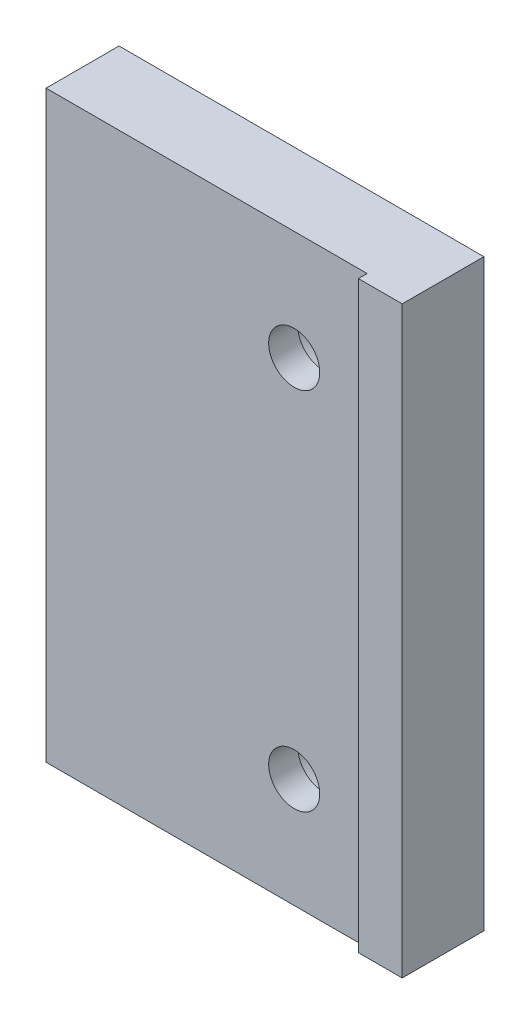
ISO-10303-21;
HEADER;
FILE_DESCRIPTION(('STEP AP214'),'2;1');
FILE_NAME('part.step','',(''),(''),'','','');
FILE_SCHEMA(('AUTOMOTIVE_DESIGN { 1 0 10303 214 1 1 1 1 }'));
ENDSEC;
DATA;
#1=APPLICATION_CONTEXT('core data for automotive mechanical design processes');
#2=APPLICATION_PROTOCOL_DEFINITION('international standard','automotive_design',2000,#1);
#3=PRODUCT_CONTEXT('',#1,'mechanical');
#4=PRODUCT('Part','Part','',(#3));
#5=PRODUCT_RELATED_PRODUCT_CATEGORY('part','',(#4));
#6=PRODUCT_DEFINITION_FORMATION('','',#4);
#7=PRODUCT_DEFINITION_CONTEXT('part definition',#1,'design');
#8=PRODUCT_DEFINITION('design','',#6,#7);
#9=PRODUCT_DEFINITION_SHAPE('','',#8);
#10=(LENGTH_UNIT() NAMED_UNIT(*) SI_UNIT(.MILLI.,.METRE.));
#11=(NAMED_UNIT(*) PLANE_ANGLE_UNIT() SI_UNIT($,.RADIAN.));
#12=(NAMED_UNIT(*) SI_UNIT($,.STERADIAN.) SOLID_ANGLE_UNIT());
#13=UNCERTAINTY_MEASURE_WITH_UNIT(LENGTH_MEASURE(1.E-05),#10,'distance_accuracy_value','');
#14=(GEOMETRIC_REPRESENTATION_CONTEXT(3) GLOBAL_UNCERTAINTY_ASSIGNED_CONTEXT((#13)) GLOBAL_UNIT_ASSIGNED_CONTEXT((#10,
#11,#12)) REPRESENTATION_CONTEXT('',''));
#15=CARTESIAN_POINT('',(0.,0.,0.));
#16=DIRECTION('',(0.,0.,1.));
#17=DIRECTION('',(1.,0.,0.));
#18=AXIS2_PLACEMENT_3D('',#15,#16,#17);
#19=CARTESIAN_POINT('',(17.,32.5,5.));
#20=DIRECTION('',(0.,0.,-1.));
#21=DIRECTION('',(-1.,0.,0.));
#22=AXIS2_PLACEMENT_3D('',#19,#20,#21);
#23=CYLINDRICAL_SURFACE('',#22,1.75);
#24=CARTESIAN_POINT('',(17.,32.5,5.));
#25=DIRECTION('',(0.,0.,1.));
#26=DIRECTION('',(1.,0.,0.));
#27=AXIS2_PLACEMENT_3D('',#24,#25,#26);
#28=CIRCLE('',#27,1.75);
#29=CARTESIAN_POINT('',(18.75,32.5,5.));
#30=VERTEX_POINT('',#29);
#31=EDGE_CURVE('E98',#30,#30,#28,.T.);
#32=ORIENTED_EDGE('',*,*,#31,.T.);
#33=EDGE_LOOP('',(#32));
#34=FACE_BOUND('',#33,.T.);
#35=CARTESIAN_POINT('',(17.,32.5,3.));
#36=DIRECTION('',(0.,0.,-1.));
#37=DIRECTION('',(-1.,0.,0.));
#38=AXIS2_PLACEMENT_3D('',#35,#36,#37);
#39=CIRCLE('',#38,1.75);
#40=CARTESIAN_POINT('',(15.25,32.5,3.));
#41=VERTEX_POINT('',#40);
#42=EDGE_CURVE('E39',#41,#41,#39,.T.);
#43=ORIENTED_EDGE('',*,*,#42,.T.);
#44=EDGE_LOOP('',(#43));
#45=FACE_BOUND('',#44,.T.);
#46=ADVANCED_FACE('F35',(#34,#45),#23,.F.);
#47=CARTESIAN_POINT('',(17.,7.5,5.));
#48=DIRECTION('',(0.,0.,-1.));
#49=DIRECTION('',(-1.,0.,0.));
#50=AXIS2_PLACEMENT_3D('',#47,#48,#49);
#51=CYLINDRICAL_SURFACE('',#50,1.75);
#52=CARTESIAN_POINT('',(17.,7.5,5.));
#53=DIRECTION('',(0.,0.,1.));
#54=DIRECTION('',(1.,0.,0.));
#55=AXIS2_PLACEMENT_3D('',#52,#53,#54);
#56=CIRCLE('',#55,1.75);
#57=CARTESIAN_POINT('',(18.75,7.5,5.));
#58=VERTEX_POINT('',#57);
#59=EDGE_CURVE('E102',#58,#58,#56,.T.);
#60=ORIENTED_EDGE('',*,*,#59,.T.);
#61=EDGE_LOOP('',(#60));
#62=FACE_BOUND('',#61,.T.);
#63=CARTESIAN_POINT('',(17.,7.5,3.));
#64=DIRECTION('',(0.,0.,-1.));
#65=DIRECTION('',(-1.,0.,0.));
#66=AXIS2_PLACEMENT_3D('',#63,#64,#65);
#67=CIRCLE('',#66,1.75);
#68=CARTESIAN_POINT('',(15.25,7.5,3.));
#69=VERTEX_POINT('',#68);
#70=EDGE_CURVE('E110',#69,#69,#67,.T.);
#71=ORIENTED_EDGE('',*,*,#70,.T.);
#72=EDGE_LOOP('',(#71));
#73=FACE_BOUND('',#72,.T.);
#74=ADVANCED_FACE('F183',(#62,#73),#51,.F.);
#75=CARTESIAN_POINT('',(0.,0.,5.));
#76=DIRECTION('',(0.,0.,-1.));
#77=DIRECTION('',(-1.,0.,0.));
#78=AXIS2_PLACEMENT_3D('',#75,#76,#77);
#79=PLANE('',#78);
#80=ORIENTED_EDGE('',*,*,#59,.F.);
#81=EDGE_LOOP('',(#80));
#82=FACE_BOUND('',#81,.T.);
#83=ORIENTED_EDGE('',*,*,#31,.F.);
#84=EDGE_LOOP('',(#83));
#85=FACE_BOUND('',#84,.T.);
#86=DIRECTION('',(0.,-1.,0.));
#87=VECTOR('',#86,1.);
#88=CARTESIAN_POINT('',(22.,40.,5.));
#89=LINE('',#88,#87);
#90=CARTESIAN_POINT('',(22.,40.,5.));
#91=VERTEX_POINT('',#90);
#92=CARTESIAN_POINT('',(22.,0.,5.));
#93=VERTEX_POINT('',#92);
#94=EDGE_CURVE('E52',#91,#93,#89,.T.);
#95=ORIENTED_EDGE('',*,*,#94,.F.);
#96=DIRECTION('',(-1.,0.,0.));
#97=VECTOR('',#96,1.);
#98=CARTESIAN_POINT('',(0.,40.,5.));
#99=LINE('',#98,#97);
#100=CARTESIAN_POINT('',(0.,40.,5.));
#101=VERTEX_POINT('',#100);
#102=EDGE_CURVE('E57',#91,#101,#99,.T.);
#103=ORIENTED_EDGE('',*,*,#102,.T.);
#104=DIRECTION('',(0.,-1.,0.));
#105=VECTOR('',#104,1.);
#106=CARTESIAN_POINT('',(0.,0.,5.));
#107=LINE('',#106,#105);
#108=CARTESIAN_POINT('',(0.,0.,5.));
#109=VERTEX_POINT('',#108);
#110=EDGE_CURVE('E88',#101,#109,#107,.T.);
#111=ORIENTED_EDGE('',*,*,#110,.T.);
#112=DIRECTION('',(1.,0.,0.));
#113=VECTOR('',#112,1.);
#114=CARTESIAN_POINT('',(0.,0.,5.));
#115=LINE('',#114,#113);
#116=EDGE_CURVE('E151',#109,#93,#115,.T.);
#117=ORIENTED_EDGE('',*,*,#116,.T.);
#118=EDGE_LOOP('',(#95,#103,#111,#117));
#119=FACE_BOUND('',#118,.T.);
#120=ADVANCED_FACE('F153',(#82,#85,#119),#79,.F.);
#121=CARTESIAN_POINT('',(0.,0.,0.));
#122=DIRECTION('',(0.,0.,-1.));
#123=DIRECTION('',(-1.,0.,0.));
#124=AXIS2_PLACEMENT_3D('',#121,#122,#123);
#125=PLANE('',#124);
#126=CARTESIAN_POINT('',(17.,7.5,0.));
#127=DIRECTION('',(0.,0.,-1.));
#128=DIRECTION('',(-1.,0.,0.));
#129=AXIS2_PLACEMENT_3D('',#126,#127,#128);
#130=CIRCLE('',#129,3.);
#131=CARTESIAN_POINT('',(14.,7.5,0.));
#132=VERTEX_POINT('',#131);
#133=EDGE_CURVE('E117',#132,#132,#130,.T.);
#134=ORIENTED_EDGE('',*,*,#133,.F.);
#135=EDGE_LOOP('',(#134));
#136=FACE_BOUND('',#135,.T.);
#137=CARTESIAN_POINT('',(17.,32.5,0.));
#138=DIRECTION('',(0.,0.,-1.));
#139=DIRECTION('',(-1.,0.,0.));
#140=AXIS2_PLACEMENT_3D('',#137,#138,#139);
#141=CIRCLE('',#140,3.);
#142=CARTESIAN_POINT('',(14.,32.5,0.));
#143=VERTEX_POINT('',#142);
#144=EDGE_CURVE('E127',#143,#143,#141,.T.);
#145=ORIENTED_EDGE('',*,*,#144,.F.);
#146=EDGE_LOOP('',(#145));
#147=FACE_BOUND('',#146,.T.);
#148=DIRECTION('',(0.,-1.,0.));
#149=VECTOR('',#148,1.);
#150=CARTESIAN_POINT('',(0.,0.,0.));
#151=LINE('',#150,#149);
#152=CARTESIAN_POINT('',(0.,40.,0.));
#153=VERTEX_POINT('',#152);
#154=CARTESIAN_POINT('',(0.,0.,0.));
#155=VERTEX_POINT('',#154);
#156=EDGE_CURVE('E94',#153,#155,#151,.T.);
#157=ORIENTED_EDGE('',*,*,#156,.F.);
#158=DIRECTION('',(-1.,0.,0.));
#159=VECTOR('',#158,1.);
#160=CARTESIAN_POINT('',(0.,40.,0.));
#161=LINE('',#160,#159);
#162=CARTESIAN_POINT('',(25.,40.,0.));
#163=VERTEX_POINT('',#162);
#164=EDGE_CURVE('E77',#163,#153,#161,.T.);
#165=ORIENTED_EDGE('',*,*,#164,.F.);
#166=DIRECTION('',(0.,1.,0.));
#167=VECTOR('',#166,1.);
#168=CARTESIAN_POINT('',(25.,0.,0.));
#169=LINE('',#168,#167);
#170=CARTESIAN_POINT('',(25.,0.,0.));
#171=VERTEX_POINT('',#170);
#172=EDGE_CURVE('E89',#171,#163,#169,.T.);
#173=ORIENTED_EDGE('',*,*,#172,.F.);
#174=DIRECTION('',(1.,0.,0.));
#175=VECTOR('',#174,1.);
#176=CARTESIAN_POINT('',(0.,0.,0.));
#177=LINE('',#176,#175);
#178=EDGE_CURVE('E97',#155,#171,#177,.T.);
#179=ORIENTED_EDGE('',*,*,#178,.F.);
#180=EDGE_LOOP('',(#157,#165,#173,#179));
#181=FACE_BOUND('',#180,.T.);
#182=ADVANCED_FACE('F96',(#136,#147,#181),#125,.T.);
#183=CARTESIAN_POINT('',(0.,0.,5.));
#184=DIRECTION('',(1.,0.,0.));
#185=DIRECTION('',(0.,0.,-1.));
#186=AXIS2_PLACEMENT_3D('',#183,#184,#185);
#187=PLANE('',#186);
#188=ORIENTED_EDGE('',*,*,#156,.T.);
#189=DIRECTION('',(0.,0.,-1.));
#190=VECTOR('',#189,1.);
#191=CARTESIAN_POINT('',(0.,0.,5.));
#192=LINE('',#191,#190);
#193=EDGE_CURVE('E11',#109,#155,#192,.T.);
#194=ORIENTED_EDGE('',*,*,#193,.F.);
#195=ORIENTED_EDGE('',*,*,#110,.F.);
#196=DIRECTION('',(0.,0.,-1.));
#197=VECTOR('',#196,1.);
#198=CARTESIAN_POINT('',(0.,40.,5.));
#199=LINE('',#198,#197);
#200=EDGE_CURVE('E80',#101,#153,#199,.T.);
#201=ORIENTED_EDGE('',*,*,#200,.T.);
#202=EDGE_LOOP('',(#188,#194,#195,#201));
#203=FACE_BOUND('',#202,.T.);
#204=ADVANCED_FACE('F37',(#203),#187,.F.);
#205=CARTESIAN_POINT('',(0.,0.,5.));
#206=DIRECTION('',(0.,1.,0.));
#207=DIRECTION('',(0.,0.,1.));
#208=AXIS2_PLACEMENT_3D('',#205,#206,#207);
#209=PLANE('',#208);
#210=ORIENTED_EDGE('',*,*,#178,.T.);
#211=DIRECTION('',(0.,0.,-1.));
#212=VECTOR('',#211,1.);
#213=CARTESIAN_POINT('',(25.,0.,5.));
#214=LINE('',#213,#212);
#215=CARTESIAN_POINT('',(25.,0.,5.6));
#216=VERTEX_POINT('',#215);
#217=EDGE_CURVE('E44',#216,#171,#214,.T.);
#218=ORIENTED_EDGE('',*,*,#217,.F.);
#219=DIRECTION('',(1.,0.,0.));
#220=VECTOR('',#219,1.);
#221=CARTESIAN_POINT('',(25.,0.,5.6));
#222=LINE('',#221,#220);
#223=CARTESIAN_POINT('',(22.,0.,5.6));
#224=VERTEX_POINT('',#223);
#225=EDGE_CURVE('E139',#224,#216,#222,.T.);
#226=ORIENTED_EDGE('',*,*,#225,.F.);
#227=DIRECTION('',(0.,0.,-1.));
#228=VECTOR('',#227,1.);
#229=CARTESIAN_POINT('',(22.,0.,5.6));
#230=LINE('',#229,#228);
#231=EDGE_CURVE('E142',#224,#93,#230,.T.);
#232=ORIENTED_EDGE('',*,*,#231,.T.);
#233=ORIENTED_EDGE('',*,*,#116,.F.);
#234=ORIENTED_EDGE('',*,*,#193,.T.);
#235=EDGE_LOOP('',(#210,#218,#226,#232,#233,#234));
#236=FACE_BOUND('',#235,.T.);
#237=ADVANCED_FACE('F163',(#236),#209,.F.);
#238=CARTESIAN_POINT('',(25.,0.,5.));
#239=DIRECTION('',(-1.,0.,0.));
#240=DIRECTION('',(0.,0.,1.));
#241=AXIS2_PLACEMENT_3D('',#238,#239,#240);
#242=PLANE('',#241);
#243=ORIENTED_EDGE('',*,*,#172,.T.);
#244=DIRECTION('',(0.,0.,-1.));
#245=VECTOR('',#244,1.);
#246=CARTESIAN_POINT('',(25.,40.,5.));
#247=LINE('',#246,#245);
#248=CARTESIAN_POINT('',(25.,40.,5.6));
#249=VERTEX_POINT('',#248);
#250=EDGE_CURVE('E84',#249,#163,#247,.T.);
#251=ORIENTED_EDGE('',*,*,#250,.F.);
#252=DIRECTION('',(0.,1.,0.));
#253=VECTOR('',#252,1.);
#254=CARTESIAN_POINT('',(25.,40.,5.6));
#255=LINE('',#254,#253);
#256=EDGE_CURVE('E130',#216,#249,#255,.T.);
#257=ORIENTED_EDGE('',*,*,#256,.F.);
#258=ORIENTED_EDGE('',*,*,#217,.T.);
#259=EDGE_LOOP('',(#243,#251,#257,#258));
#260=FACE_BOUND('',#259,.T.);
#261=ADVANCED_FACE('F172',(#260),#242,.F.);
#262=CARTESIAN_POINT('',(0.,40.,5.));
#263=DIRECTION('',(0.,-1.,0.));
#264=DIRECTION('',(0.,0.,-1.));
#265=AXIS2_PLACEMENT_3D('',#262,#263,#264);
#266=PLANE('',#265);
#267=ORIENTED_EDGE('',*,*,#164,.T.);
#268=ORIENTED_EDGE('',*,*,#200,.F.);
#269=ORIENTED_EDGE('',*,*,#102,.F.);
#270=DIRECTION('',(0.,0.,-1.));
#271=VECTOR('',#270,1.);
#272=CARTESIAN_POINT('',(22.,40.,5.6));
#273=LINE('',#272,#271);
#274=CARTESIAN_POINT('',(22.,40.,5.6));
#275=VERTEX_POINT('',#274);
#276=EDGE_CURVE('E146',#275,#91,#273,.T.);
#277=ORIENTED_EDGE('',*,*,#276,.F.);
#278=DIRECTION('',(-1.,0.,0.));
#279=VECTOR('',#278,1.);
#280=CARTESIAN_POINT('',(25.,40.,5.6));
#281=LINE('',#280,#279);
#282=EDGE_CURVE('E133',#249,#275,#281,.T.);
#283=ORIENTED_EDGE('',*,*,#282,.F.);
#284=ORIENTED_EDGE('',*,*,#250,.T.);
#285=EDGE_LOOP('',(#267,#268,#269,#277,#283,#284));
#286=FACE_BOUND('',#285,.T.);
#287=ADVANCED_FACE('F79',(#286),#266,.F.);
#288=CARTESIAN_POINT('',(22.,40.,5.6));
#289=DIRECTION('',(1.,0.,0.));
#290=DIRECTION('',(0.,1.,0.));
#291=AXIS2_PLACEMENT_3D('',#288,#289,#290);
#292=PLANE('',#291);
#293=ORIENTED_EDGE('',*,*,#94,.T.);
#294=ORIENTED_EDGE('',*,*,#231,.F.);
#295=DIRECTION('',(0.,-1.,0.));
#296=VECTOR('',#295,1.);
#297=CARTESIAN_POINT('',(22.,40.,5.6));
#298=LINE('',#297,#296);
#299=EDGE_CURVE('E136',#275,#224,#298,.T.);
#300=ORIENTED_EDGE('',*,*,#299,.F.);
#301=ORIENTED_EDGE('',*,*,#276,.T.);
#302=EDGE_LOOP('',(#293,#294,#300,#301));
#303=FACE_BOUND('',#302,.T.);
#304=ADVANCED_FACE('F158',(#303),#292,.F.);
#305=CARTESIAN_POINT('',(0.,0.,5.6));
#306=DIRECTION('',(0.,0.,-1.));
#307=DIRECTION('',(-1.,0.,0.));
#308=AXIS2_PLACEMENT_3D('',#305,#306,#307);
#309=PLANE('',#308);
#310=ORIENTED_EDGE('',*,*,#256,.T.);
#311=ORIENTED_EDGE('',*,*,#282,.T.);
#312=ORIENTED_EDGE('',*,*,#299,.T.);
#313=ORIENTED_EDGE('',*,*,#225,.T.);
#314=EDGE_LOOP('',(#310,#311,#312,#313));
#315=FACE_BOUND('',#314,.T.);
#316=ADVANCED_FACE('F169',(#315),#309,.F.);
#317=CARTESIAN_POINT('',(17.,7.5,3.));
#318=DIRECTION('',(0.,0.,-1.));
#319=DIRECTION('',(-1.,0.,0.));
#320=AXIS2_PLACEMENT_3D('',#317,#318,#319);
#321=CYLINDRICAL_SURFACE('',#320,3.);
#322=CARTESIAN_POINT('',(17.,7.5,3.));
#323=DIRECTION('',(0.,0.,-1.));
#324=DIRECTION('',(-1.,0.,0.));
#325=AXIS2_PLACEMENT_3D('',#322,#323,#324);
#326=CIRCLE('',#325,3.);
#327=CARTESIAN_POINT('',(14.,7.5,3.));
#328=VERTEX_POINT('',#327);
#329=EDGE_CURVE('E112',#328,#328,#326,.T.);
#330=ORIENTED_EDGE('',*,*,#329,.F.);
#331=EDGE_LOOP('',(#330));
#332=FACE_BOUND('',#331,.T.);
#333=ORIENTED_EDGE('',*,*,#133,.T.);
#334=EDGE_LOOP('',(#333));
#335=FACE_BOUND('',#334,.T.);
#336=ADVANCED_FACE('F220',(#332,#335),#321,.F.);
#337=CARTESIAN_POINT('',(17.,7.5,3.));
#338=DIRECTION('',(0.,0.,-1.));
#339=DIRECTION('',(-1.,0.,0.));
#340=AXIS2_PLACEMENT_3D('',#337,#338,#339);
#341=PLANE('',#340);
#342=ORIENTED_EDGE('',*,*,#70,.F.);
#343=EDGE_LOOP('',(#342));
#344=FACE_BOUND('',#343,.T.);
#345=ORIENTED_EDGE('',*,*,#329,.T.);
#346=EDGE_LOOP('',(#345));
#347=FACE_BOUND('',#346,.T.);
#348=ADVANCED_FACE('F211',(#344,#347),#341,.T.);
#349=CARTESIAN_POINT('',(17.,32.5,3.));
#350=DIRECTION('',(0.,0.,-1.));
#351=DIRECTION('',(-1.,0.,0.));
#352=AXIS2_PLACEMENT_3D('',#349,#350,#351);
#353=CYLINDRICAL_SURFACE('',#352,3.);
#354=CARTESIAN_POINT('',(17.,32.5,3.));
#355=DIRECTION('',(0.,0.,-1.));
#356=DIRECTION('',(-1.,0.,0.));
#357=AXIS2_PLACEMENT_3D('',#354,#355,#356);
#358=CIRCLE('',#357,3.);
#359=CARTESIAN_POINT('',(14.,32.5,3.));
#360=VERTEX_POINT('',#359);
#361=EDGE_CURVE('E122',#360,#360,#358,.T.);
#362=ORIENTED_EDGE('',*,*,#361,.F.);
#363=EDGE_LOOP('',(#362));
#364=FACE_BOUND('',#363,.T.);
#365=ORIENTED_EDGE('',*,*,#144,.T.);
#366=EDGE_LOOP('',(#365));
#367=FACE_BOUND('',#366,.T.);
#368=ADVANCED_FACE('F208',(#364,#367),#353,.F.);
#369=CARTESIAN_POINT('',(17.,32.5,3.));
#370=DIRECTION('',(0.,0.,-1.));
#371=DIRECTION('',(-1.,0.,0.));
#372=AXIS2_PLACEMENT_3D('',#369,#370,#371);
#373=PLANE('',#372);
#374=ORIENTED_EDGE('',*,*,#42,.F.);
#375=EDGE_LOOP('',(#374));
#376=FACE_BOUND('',#375,.T.);
#377=ORIENTED_EDGE('',*,*,#361,.T.);
#378=EDGE_LOOP('',(#377));
#379=FACE_BOUND('',#378,.T.);
#380=ADVANCED_FACE('F210',(#376,#379),#373,.T.);
#381=CLOSED_SHELL('',(#46,#74,#120,#182,#204,#237,#261,#287,#304,#316,#336,#348,#368,#380));
#382=MANIFOLD_SOLID_BREP('B2',#381);
#383=ADVANCED_BREP_SHAPE_REPRESENTATION('',(#18,#382),#14);
#384=SHAPE_DEFINITION_REPRESENTATION(#9,#383);
ENDSEC;
END-ISO-10303-21;
